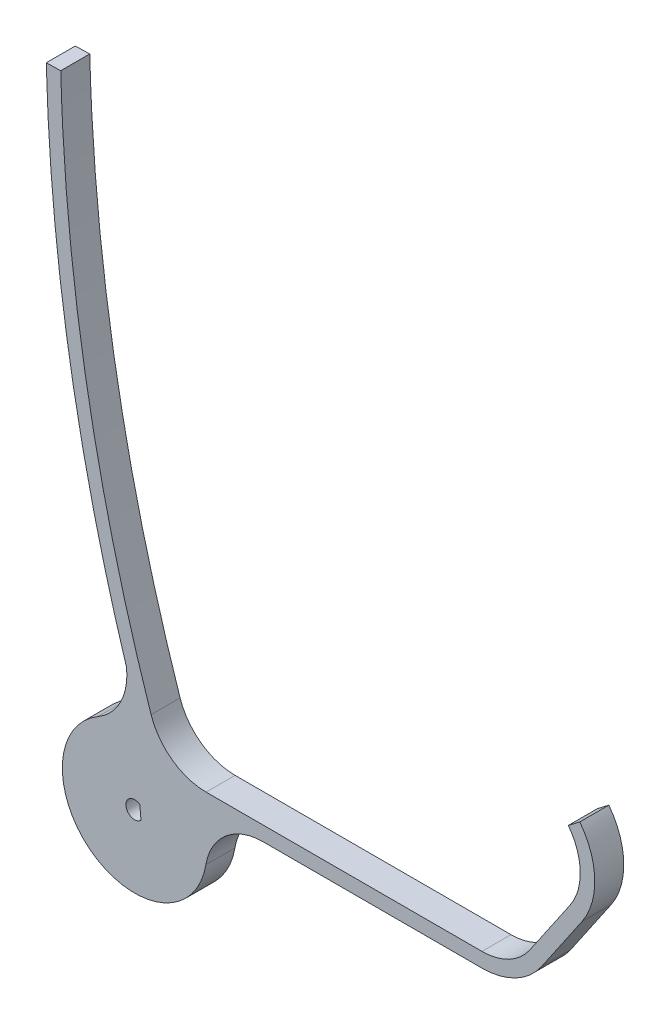
ISO-10303-21;
HEADER;
FILE_DESCRIPTION(('STEP AP214'),'2;1');
FILE_NAME('part.step','',(''),(''),'','','');
FILE_SCHEMA(('AUTOMOTIVE_DESIGN { 1 0 10303 214 1 1 1 1 }'));
ENDSEC;
DATA;
#1=APPLICATION_CONTEXT('core data for automotive mechanical design processes');
#2=APPLICATION_PROTOCOL_DEFINITION('international standard','automotive_design',2000,#1);
#3=PRODUCT_CONTEXT('',#1,'mechanical');
#4=PRODUCT('Part','Part','',(#3));
#5=PRODUCT_RELATED_PRODUCT_CATEGORY('part','',(#4));
#6=PRODUCT_DEFINITION_FORMATION('','',#4);
#7=PRODUCT_DEFINITION_CONTEXT('part definition',#1,'design');
#8=PRODUCT_DEFINITION('design','',#6,#7);
#9=PRODUCT_DEFINITION_SHAPE('','',#8);
#10=(LENGTH_UNIT() NAMED_UNIT(*) SI_UNIT(.MILLI.,.METRE.));
#11=(NAMED_UNIT(*) PLANE_ANGLE_UNIT() SI_UNIT($,.RADIAN.));
#12=(NAMED_UNIT(*) SI_UNIT($,.STERADIAN.) SOLID_ANGLE_UNIT());
#13=UNCERTAINTY_MEASURE_WITH_UNIT(LENGTH_MEASURE(1.E-05),#10,'distance_accuracy_value','');
#14=(GEOMETRIC_REPRESENTATION_CONTEXT(3) GLOBAL_UNCERTAINTY_ASSIGNED_CONTEXT((#13)) GLOBAL_UNIT_ASSIGNED_CONTEXT((#10,
#11,#12)) REPRESENTATION_CONTEXT('',''));
#15=CARTESIAN_POINT('',(0.,0.,0.));
#16=DIRECTION('',(0.,0.,1.));
#17=DIRECTION('',(1.,0.,0.));
#18=AXIS2_PLACEMENT_3D('',#15,#16,#17);
#19=CARTESIAN_POINT('',(-1.09544401618113,41.3581316566819,-5.));
#20=DIRECTION('',(-0.0264775007978283,0.999649409518908,0.));
#21=DIRECTION('',(-0.999649409518908,-0.0264775007978283,0.));
#22=AXIS2_PLACEMENT_3D('',#19,#20,#21);
#23=PLANE('',#22);
#24=DIRECTION('',(-0.999649409518908,-0.0264775007978283,0.));
#25=VECTOR('',#24,1.);
#26=CARTESIAN_POINT('',(-1.09544401618113,41.3581316566819,0.));
#27=LINE('',#26,#25);
#28=CARTESIAN_POINT('',(-45.8899837622677,40.1716682320337,0.));
#29=VERTEX_POINT('',#28);
#30=CARTESIAN_POINT('',(-48.3891072861844,40.1054744800359,0.));
#31=VERTEX_POINT('',#30);
#32=EDGE_CURVE('E208',#29,#31,#27,.T.);
#33=ORIENTED_EDGE('',*,*,#32,.F.);
#34=DIRECTION('',(0.,0.,1.));
#35=VECTOR('',#34,1.);
#36=CARTESIAN_POINT('',(-45.8899837622677,40.1716682320337,-5.));
#37=LINE('',#36,#35);
#38=CARTESIAN_POINT('',(-45.8899837622677,40.1716682320337,-5.));
#39=VERTEX_POINT('',#38);
#40=EDGE_CURVE('E249',#39,#29,#37,.T.);
#41=ORIENTED_EDGE('',*,*,#40,.F.);
#42=DIRECTION('',(-0.999649409518908,-0.0264775007978283,0.));
#43=VECTOR('',#42,1.);
#44=CARTESIAN_POINT('',(-1.09544401618113,41.3581316566819,-5.));
#45=LINE('',#44,#43);
#46=CARTESIAN_POINT('',(-48.3891072861844,40.1054744800359,-5.));
#47=VERTEX_POINT('',#46);
#48=EDGE_CURVE('E210',#39,#47,#45,.T.);
#49=ORIENTED_EDGE('',*,*,#48,.T.);
#50=DIRECTION('',(0.,0.,1.));
#51=VECTOR('',#50,1.);
#52=CARTESIAN_POINT('',(-48.3891072861844,40.1054744800359,-5.));
#53=LINE('',#52,#51);
#54=EDGE_CURVE('E250',#47,#31,#53,.T.);
#55=ORIENTED_EDGE('',*,*,#54,.T.);
#56=EDGE_LOOP('',(#33,#41,#49,#55));
#57=FACE_BOUND('',#56,.T.);
#58=ADVANCED_FACE('F39',(#57),#23,.T.);
#59=CARTESIAN_POINT('',(986707.552112871,164089.765893082,-5.));
#60=CARTESIAN_POINT('',(-982178.543983185,-188171.282060806,-5.));
#61=CARTESIAN_POINT('',(977487.176227722,212216.742655477,-5.));
#62=B_SPLINE_CURVE_WITH_KNOTS('',2,(#59,#60,#61),.UNSPECIFIED.,.F.,.F.,(3,3),(0.,1.),.UNSPECIFIED.);
#63=DIRECTION('',(0.,0.,1.));
#64=VECTOR('',#63,1.);
#65=SURFACE_OF_LINEAR_EXTRUSION('',#62,#64);
#66=CARTESIAN_POINT('',(986707.552112871,164089.765893082,0.));
#67=CARTESIAN_POINT('',(-982178.543983185,-188171.282060806,0.));
#68=CARTESIAN_POINT('',(977487.176227722,212216.742655477,0.));
#69=B_SPLINE_CURVE_WITH_KNOTS('',2,(#66,#67,#68),.UNSPECIFIED.,.F.,.F.,(3,3),(0.,1.),.UNSPECIFIED.);
#70=CARTESIAN_POINT('',(-30.3198198251759,-48.1747394512281,0.));
#71=VERTEX_POINT('',#70);
#72=EDGE_CURVE('E214',#71,#29,#69,.T.);
#73=ORIENTED_EDGE('',*,*,#72,.F.);
#74=DIRECTION('',(0.,0.,1.));
#75=VECTOR('',#74,1.);
#76=CARTESIAN_POINT('',(-30.3198198251759,-48.1747394512281,-5.));
#77=LINE('',#76,#75);
#78=CARTESIAN_POINT('',(-30.3198198251759,-48.1747394512281,-5.));
#79=VERTEX_POINT('',#78);
#80=EDGE_CURVE('E279',#79,#71,#77,.T.);
#81=ORIENTED_EDGE('',*,*,#80,.F.);
#82=EDGE_CURVE('E253',#79,#39,#62,.T.);
#83=ORIENTED_EDGE('',*,*,#82,.T.);
#84=ORIENTED_EDGE('',*,*,#40,.T.);
#85=EDGE_LOOP('',(#73,#81,#83,#84));
#86=FACE_BOUND('',#85,.T.);
#87=ADVANCED_FACE('F235',(#86),#65,.T.);
#88=CARTESIAN_POINT('',(-20.837149873268,-45.,-5.));
#89=DIRECTION('',(0.,0.,1.));
#90=DIRECTION('',(1.,0.,0.));
#91=AXIS2_PLACEMENT_3D('',#88,#89,#90);
#92=CYLINDRICAL_SURFACE('',#91,10.);
#93=CARTESIAN_POINT('',(-20.837149873268,-45.,0.));
#94=DIRECTION('',(0.,0.,1.));
#95=DIRECTION('',(1.,0.,0.));
#96=AXIS2_PLACEMENT_3D('',#93,#94,#95);
#97=CIRCLE('',#96,10.);
#98=CARTESIAN_POINT('',(-20.837149873268,-55.,0.));
#99=VERTEX_POINT('',#98);
#100=EDGE_CURVE('E286',#71,#99,#97,.T.);
#101=ORIENTED_EDGE('',*,*,#100,.T.);
#102=DIRECTION('',(0.,0.,1.));
#103=VECTOR('',#102,1.);
#104=CARTESIAN_POINT('',(-20.837149873268,-55.,-5.));
#105=LINE('',#104,#103);
#106=CARTESIAN_POINT('',(-20.837149873268,-55.,-5.));
#107=VERTEX_POINT('',#106);
#108=EDGE_CURVE('E277',#107,#99,#105,.T.);
#109=ORIENTED_EDGE('',*,*,#108,.F.);
#110=CARTESIAN_POINT('',(-20.837149873268,-45.,-5.));
#111=DIRECTION('',(0.,0.,1.));
#112=DIRECTION('',(1.,0.,0.));
#113=AXIS2_PLACEMENT_3D('',#110,#111,#112);
#114=CIRCLE('',#113,10.);
#115=EDGE_CURVE('E343',#79,#107,#114,.T.);
#116=ORIENTED_EDGE('',*,*,#115,.F.);
#117=ORIENTED_EDGE('',*,*,#80,.T.);
#118=EDGE_LOOP('',(#101,#109,#116,#117));
#119=FACE_BOUND('',#118,.T.);
#120=ADVANCED_FACE('F352',(#119),#92,.F.);
#121=CARTESIAN_POINT('',(0.,-55.,-5.));
#122=DIRECTION('',(0.,1.,0.));
#123=DIRECTION('',(0.,0.,1.));
#124=AXIS2_PLACEMENT_3D('',#121,#122,#123);
#125=PLANE('',#124);
#126=DIRECTION('',(-1.,0.,0.));
#127=VECTOR('',#126,1.);
#128=CARTESIAN_POINT('',(0.,-55.,0.));
#129=LINE('',#128,#127);
#130=CARTESIAN_POINT('',(26.7198130855547,-55.,0.));
#131=VERTEX_POINT('',#130);
#132=EDGE_CURVE('E292',#131,#99,#129,.T.);
#133=ORIENTED_EDGE('',*,*,#132,.F.);
#134=DIRECTION('',(0.,0.,1.));
#135=VECTOR('',#134,1.);
#136=CARTESIAN_POINT('',(26.7198130855547,-55.,-5.));
#137=LINE('',#136,#135);
#138=CARTESIAN_POINT('',(26.7198130855547,-55.,-5.));
#139=VERTEX_POINT('',#138);
#140=EDGE_CURVE('E275',#139,#131,#137,.T.);
#141=ORIENTED_EDGE('',*,*,#140,.F.);
#142=DIRECTION('',(-1.,0.,0.));
#143=VECTOR('',#142,1.);
#144=CARTESIAN_POINT('',(0.,-55.,-5.));
#145=LINE('',#144,#143);
#146=EDGE_CURVE('E444',#139,#107,#145,.T.);
#147=ORIENTED_EDGE('',*,*,#146,.T.);
#148=ORIENTED_EDGE('',*,*,#108,.T.);
#149=EDGE_LOOP('',(#133,#141,#147,#148));
#150=FACE_BOUND('',#149,.T.);
#151=ADVANCED_FACE('F358',(#150),#125,.T.);
#152=CARTESIAN_POINT('',(26.7198130855547,-45.,-5.));
#153=DIRECTION('',(0.,0.,1.));
#154=DIRECTION('',(1.,0.,0.));
#155=AXIS2_PLACEMENT_3D('',#152,#153,#154);
#156=CYLINDRICAL_SURFACE('',#155,10.);
#157=CARTESIAN_POINT('',(26.7198130855547,-45.,0.));
#158=DIRECTION('',(0.,0.,1.));
#159=DIRECTION('',(1.,0.,0.));
#160=AXIS2_PLACEMENT_3D('',#157,#158,#159);
#161=CIRCLE('',#160,10.);
#162=CARTESIAN_POINT('',(34.97782290429,-50.6396164615753,0.));
#163=VERTEX_POINT('',#162);
#164=EDGE_CURVE('E295',#131,#163,#161,.T.);
#165=ORIENTED_EDGE('',*,*,#164,.T.);
#166=DIRECTION('',(0.,0.,1.));
#167=VECTOR('',#166,1.);
#168=CARTESIAN_POINT('',(34.97782290429,-50.6396164615753,-5.));
#169=LINE('',#168,#167);
#170=CARTESIAN_POINT('',(34.97782290429,-50.6396164615753,-5.));
#171=VERTEX_POINT('',#170);
#172=EDGE_CURVE('E273',#171,#163,#169,.T.);
#173=ORIENTED_EDGE('',*,*,#172,.F.);
#174=CARTESIAN_POINT('',(26.7198130855547,-45.,-5.));
#175=DIRECTION('',(0.,0.,1.));
#176=DIRECTION('',(1.,0.,0.));
#177=AXIS2_PLACEMENT_3D('',#174,#175,#176);
#178=CIRCLE('',#177,10.);
#179=EDGE_CURVE('E443',#139,#171,#178,.T.);
#180=ORIENTED_EDGE('',*,*,#179,.F.);
#181=ORIENTED_EDGE('',*,*,#140,.T.);
#182=EDGE_LOOP('',(#165,#173,#180,#181));
#183=FACE_BOUND('',#182,.T.);
#184=ADVANCED_FACE('F362',(#183),#156,.F.);
#185=CARTESIAN_POINT('',(47.4369168356998,-32.3959432048682,-5.));
#186=DIRECTION('',(-0.82580098187353,0.563961646157533,0.));
#187=DIRECTION('',(-0.563961646157533,-0.82580098187353,0.));
#188=AXIS2_PLACEMENT_3D('',#185,#186,#187);
#189=PLANE('',#188);
#190=DIRECTION('',(-0.563961646157533,-0.82580098187353,0.));
#191=VECTOR('',#190,1.);
#192=CARTESIAN_POINT('',(47.4369168356998,-32.3959432048682,0.));
#193=LINE('',#192,#191);
#194=CARTESIAN_POINT('',(41.9191665326047,-40.475506148686,0.));
#195=VERTEX_POINT('',#194);
#196=EDGE_CURVE('E298',#195,#163,#193,.T.);
#197=ORIENTED_EDGE('',*,*,#196,.F.);
#198=DIRECTION('',(0.,0.,1.));
#199=VECTOR('',#198,1.);
#200=CARTESIAN_POINT('',(41.9191665326047,-40.475506148686,-5.));
#201=LINE('',#200,#199);
#202=CARTESIAN_POINT('',(41.9191665326047,-40.475506148686,-5.));
#203=VERTEX_POINT('',#202);
#204=EDGE_CURVE('E271',#203,#195,#201,.T.);
#205=ORIENTED_EDGE('',*,*,#204,.F.);
#206=DIRECTION('',(-0.563961646157533,-0.82580098187353,0.));
#207=VECTOR('',#206,1.);
#208=CARTESIAN_POINT('',(47.4369168356998,-32.3959432048682,-5.));
#209=LINE('',#208,#207);
#210=EDGE_CURVE('E440',#203,#171,#209,.T.);
#211=ORIENTED_EDGE('',*,*,#210,.T.);
#212=ORIENTED_EDGE('',*,*,#172,.T.);
#213=EDGE_LOOP('',(#197,#205,#211,#212));
#214=FACE_BOUND('',#213,.T.);
#215=ADVANCED_FACE('F366',(#214),#189,.T.);
#216=CARTESIAN_POINT('',(33.6611567138694,-34.8358896871107,-5.));
#217=DIRECTION('',(0.,0.,1.));
#218=DIRECTION('',(1.,0.,0.));
#219=AXIS2_PLACEMENT_3D('',#216,#217,#218);
#220=CYLINDRICAL_SURFACE('',#219,10.);
#221=CARTESIAN_POINT('',(33.6611567138694,-34.8358896871107,0.));
#222=DIRECTION('',(0.,0.,1.));
#223=DIRECTION('',(1.,0.,0.));
#224=AXIS2_PLACEMENT_3D('',#221,#222,#223);
#225=CIRCLE('',#224,10.);
#226=CARTESIAN_POINT('',(41.6001190229847,-28.7553570250452,0.));
#227=VERTEX_POINT('',#226);
#228=EDGE_CURVE('E301',#195,#227,#225,.T.);
#229=ORIENTED_EDGE('',*,*,#228,.T.);
#230=DIRECTION('',(0.,0.,1.));
#231=VECTOR('',#230,1.);
#232=CARTESIAN_POINT('',(41.6001190229847,-28.7553570250452,-5.));
#233=LINE('',#232,#231);
#234=CARTESIAN_POINT('',(41.6001190229847,-28.7553570250452,-5.));
#235=VERTEX_POINT('',#234);
#236=EDGE_CURVE('E269',#235,#227,#233,.T.);
#237=ORIENTED_EDGE('',*,*,#236,.F.);
#238=CARTESIAN_POINT('',(33.6611567138694,-34.8358896871107,-5.));
#239=DIRECTION('',(0.,0.,1.));
#240=DIRECTION('',(1.,0.,0.));
#241=AXIS2_PLACEMENT_3D('',#238,#239,#240);
#242=CIRCLE('',#241,10.);
#243=EDGE_CURVE('E438',#203,#235,#242,.T.);
#244=ORIENTED_EDGE('',*,*,#243,.F.);
#245=ORIENTED_EDGE('',*,*,#204,.T.);
#246=EDGE_LOOP('',(#229,#237,#244,#245));
#247=FACE_BOUND('',#246,.T.);
#248=ADVANCED_FACE('F370',(#247),#220,.F.);
#249=CARTESIAN_POINT('',(29.2618689221314,-38.2053493300637,-5.));
#250=DIRECTION('',(-0.608053266206553,0.793896230911536,0.));
#251=DIRECTION('',(-0.793896230911536,-0.608053266206553,0.));
#252=AXIS2_PLACEMENT_3D('',#249,#250,#251);
#253=PLANE('',#252);
#254=DIRECTION('',(-0.793896230911536,-0.608053266206553,0.));
#255=VECTOR('',#254,1.);
#256=CARTESIAN_POINT('',(29.2618689221314,-38.2053493300637,0.));
#257=LINE('',#256,#255);
#258=CARTESIAN_POINT('',(43.5848596002636,-27.2352238595288,0.));
#259=VERTEX_POINT('',#258);
#260=EDGE_CURVE('E304',#259,#227,#257,.T.);
#261=ORIENTED_EDGE('',*,*,#260,.F.);
#262=DIRECTION('',(0.,0.,1.));
#263=VECTOR('',#262,1.);
#264=CARTESIAN_POINT('',(43.5848596002636,-27.2352238595288,-5.));
#265=LINE('',#264,#263);
#266=CARTESIAN_POINT('',(43.5848596002636,-27.2352238595288,-5.));
#267=VERTEX_POINT('',#266);
#268=EDGE_CURVE('E267',#267,#259,#265,.T.);
#269=ORIENTED_EDGE('',*,*,#268,.F.);
#270=DIRECTION('',(-0.793896230911536,-0.608053266206553,0.));
#271=VECTOR('',#270,1.);
#272=CARTESIAN_POINT('',(29.2618689221314,-38.2053493300637,-5.));
#273=LINE('',#272,#271);
#274=EDGE_CURVE('E435',#267,#235,#273,.T.);
#275=ORIENTED_EDGE('',*,*,#274,.T.);
#276=ORIENTED_EDGE('',*,*,#236,.T.);
#277=EDGE_LOOP('',(#261,#269,#275,#276));
#278=FACE_BOUND('',#277,.T.);
#279=ADVANCED_FACE('F374',(#278),#253,.T.);
#280=CARTESIAN_POINT('',(33.6611567138694,-34.8358896871107,-5.));
#281=DIRECTION('',(0.,0.,1.));
#282=DIRECTION('',(1.,0.,0.));
#283=AXIS2_PLACEMENT_3D('',#280,#281,#282);
#284=CYLINDRICAL_SURFACE('',#283,12.5);
#285=CARTESIAN_POINT('',(33.6611567138694,-34.8358896871107,0.));
#286=DIRECTION('',(0.,0.,1.));
#287=DIRECTION('',(1.,0.,0.));
#288=AXIS2_PLACEMENT_3D('',#285,#286,#287);
#289=CIRCLE('',#288,12.5);
#290=CARTESIAN_POINT('',(43.9836689872885,-41.8854102640799,0.));
#291=VERTEX_POINT('',#290);
#292=EDGE_CURVE('E307',#291,#259,#289,.T.);
#293=ORIENTED_EDGE('',*,*,#292,.F.);
#294=DIRECTION('',(0.,0.,1.));
#295=VECTOR('',#294,1.);
#296=CARTESIAN_POINT('',(43.9836689872885,-41.8854102640799,-5.));
#297=LINE('',#296,#295);
#298=CARTESIAN_POINT('',(43.9836689872885,-41.8854102640799,-5.));
#299=VERTEX_POINT('',#298);
#300=EDGE_CURVE('E265',#299,#291,#297,.T.);
#301=ORIENTED_EDGE('',*,*,#300,.F.);
#302=CARTESIAN_POINT('',(33.6611567138694,-34.8358896871107,-5.));
#303=DIRECTION('',(0.,0.,1.));
#304=DIRECTION('',(1.,0.,0.));
#305=AXIS2_PLACEMENT_3D('',#302,#303,#304);
#306=CIRCLE('',#305,12.5);
#307=EDGE_CURVE('E432',#299,#267,#306,.T.);
#308=ORIENTED_EDGE('',*,*,#307,.T.);
#309=ORIENTED_EDGE('',*,*,#268,.T.);
#310=EDGE_LOOP('',(#293,#301,#308,#309));
#311=FACE_BOUND('',#310,.T.);
#312=ADVANCED_FACE('F378',(#311),#284,.T.);
#313=CARTESIAN_POINT('',(49.5014192903836,-33.805847320262,-5.));
#314=DIRECTION('',(-0.82580098187353,0.563961646157532,0.));
#315=DIRECTION('',(-0.563961646157532,-0.82580098187353,0.));
#316=AXIS2_PLACEMENT_3D('',#313,#314,#315);
#317=PLANE('',#316);
#318=DIRECTION('',(-0.563961646157532,-0.82580098187353,0.));
#319=VECTOR('',#318,1.);
#320=CARTESIAN_POINT('',(49.5014192903836,-33.805847320262,0.));
#321=LINE('',#320,#319);
#322=CARTESIAN_POINT('',(37.0423253589739,-52.0495205769692,0.));
#323=VERTEX_POINT('',#322);
#324=EDGE_CURVE('E310',#291,#323,#321,.T.);
#325=ORIENTED_EDGE('',*,*,#324,.T.);
#326=DIRECTION('',(0.,0.,1.));
#327=VECTOR('',#326,1.);
#328=CARTESIAN_POINT('',(37.0423253589739,-52.0495205769692,-5.));
#329=LINE('',#328,#327);
#330=CARTESIAN_POINT('',(37.0423253589739,-52.0495205769692,-5.));
#331=VERTEX_POINT('',#330);
#332=EDGE_CURVE('E263',#331,#323,#329,.T.);
#333=ORIENTED_EDGE('',*,*,#332,.F.);
#334=DIRECTION('',(-0.563961646157532,-0.82580098187353,0.));
#335=VECTOR('',#334,1.);
#336=CARTESIAN_POINT('',(49.5014192903836,-33.805847320262,-5.));
#337=LINE('',#336,#335);
#338=EDGE_CURVE('E430',#299,#331,#337,.T.);
#339=ORIENTED_EDGE('',*,*,#338,.F.);
#340=ORIENTED_EDGE('',*,*,#300,.T.);
#341=EDGE_LOOP('',(#325,#333,#339,#340));
#342=FACE_BOUND('',#341,.T.);
#343=ADVANCED_FACE('F382',(#342),#317,.F.);
#344=CARTESIAN_POINT('',(26.7198130855547,-45.,-5.));
#345=DIRECTION('',(0.,0.,1.));
#346=DIRECTION('',(1.,0.,0.));
#347=AXIS2_PLACEMENT_3D('',#344,#345,#346);
#348=CYLINDRICAL_SURFACE('',#347,12.5);
#349=CARTESIAN_POINT('',(26.7198130855547,-45.,0.));
#350=DIRECTION('',(0.,0.,1.));
#351=DIRECTION('',(1.,0.,0.));
#352=AXIS2_PLACEMENT_3D('',#349,#350,#351);
#353=CIRCLE('',#352,12.5);
#354=CARTESIAN_POINT('',(26.7198130855547,-57.5,0.));
#355=VERTEX_POINT('',#354);
#356=EDGE_CURVE('E313',#355,#323,#353,.T.);
#357=ORIENTED_EDGE('',*,*,#356,.F.);
#358=DIRECTION('',(0.,0.,1.));
#359=VECTOR('',#358,1.);
#360=CARTESIAN_POINT('',(26.7198130855547,-57.5,-5.));
#361=LINE('',#360,#359);
#362=CARTESIAN_POINT('',(26.7198130855547,-57.5,-5.));
#363=VERTEX_POINT('',#362);
#364=EDGE_CURVE('E261',#363,#355,#361,.T.);
#365=ORIENTED_EDGE('',*,*,#364,.F.);
#366=CARTESIAN_POINT('',(26.7198130855547,-45.,-5.));
#367=DIRECTION('',(0.,0.,1.));
#368=DIRECTION('',(1.,0.,0.));
#369=AXIS2_PLACEMENT_3D('',#366,#367,#368);
#370=CIRCLE('',#369,12.5);
#371=EDGE_CURVE('E427',#363,#331,#370,.T.);
#372=ORIENTED_EDGE('',*,*,#371,.T.);
#373=ORIENTED_EDGE('',*,*,#332,.T.);
#374=EDGE_LOOP('',(#357,#365,#372,#373));
#375=FACE_BOUND('',#374,.T.);
#376=ADVANCED_FACE('F386',(#375),#348,.T.);
#377=CARTESIAN_POINT('',(0.,-57.5,-5.));
#378=DIRECTION('',(0.,1.,0.));
#379=DIRECTION('',(-1.,0.,0.));
#380=AXIS2_PLACEMENT_3D('',#377,#378,#379);
#381=PLANE('',#380);
#382=DIRECTION('',(-1.,0.,0.));
#383=VECTOR('',#382,1.);
#384=CARTESIAN_POINT('',(0.,-57.5,0.));
#385=LINE('',#384,#383);
#386=CARTESIAN_POINT('',(-11.005286187164,-57.5,0.));
#387=VERTEX_POINT('',#386);
#388=EDGE_CURVE('E316',#355,#387,#385,.T.);
#389=ORIENTED_EDGE('',*,*,#388,.T.);
#390=DIRECTION('',(0.,0.,1.));
#391=VECTOR('',#390,1.);
#392=CARTESIAN_POINT('',(-11.005286187164,-57.5,-5.));
#393=LINE('',#392,#391);
#394=CARTESIAN_POINT('',(-11.005286187164,-57.5,-5.));
#395=VERTEX_POINT('',#394);
#396=EDGE_CURVE('E259',#395,#387,#393,.T.);
#397=ORIENTED_EDGE('',*,*,#396,.F.);
#398=DIRECTION('',(-1.,0.,0.));
#399=VECTOR('',#398,1.);
#400=CARTESIAN_POINT('',(0.,-57.5,-5.));
#401=LINE('',#400,#399);
#402=EDGE_CURVE('E423',#363,#395,#401,.T.);
#403=ORIENTED_EDGE('',*,*,#402,.F.);
#404=ORIENTED_EDGE('',*,*,#364,.T.);
#405=EDGE_LOOP('',(#389,#397,#403,#404));
#406=FACE_BOUND('',#405,.T.);
#407=ADVANCED_FACE('F390',(#406),#381,.F.);
#408=CARTESIAN_POINT('',(-11.005286187164,-67.5,-5.));
#409=DIRECTION('',(0.,0.,1.));
#410=DIRECTION('',(1.,0.,0.));
#411=AXIS2_PLACEMENT_3D('',#408,#409,#410);
#412=CYLINDRICAL_SURFACE('',#411,10.);
#413=CARTESIAN_POINT('',(-11.005286187164,-67.5,0.));
#414=DIRECTION('',(0.,0.,1.));
#415=DIRECTION('',(1.,0.,0.));
#416=AXIS2_PLACEMENT_3D('',#413,#414,#415);
#417=CIRCLE('',#416,10.);
#418=CARTESIAN_POINT('',(-20.8673451475003,-65.8447679731078,0.));
#419=VERTEX_POINT('',#418);
#420=EDGE_CURVE('E319',#419,#387,#417,.F.);
#421=ORIENTED_EDGE('',*,*,#420,.F.);
#422=DIRECTION('',(0.,0.,1.));
#423=VECTOR('',#422,1.);
#424=CARTESIAN_POINT('',(-20.8673451475003,-65.8447679731078,-5.));
#425=LINE('',#424,#423);
#426=CARTESIAN_POINT('',(-20.8673451475003,-65.8447679731078,-5.));
#427=VERTEX_POINT('',#426);
#428=EDGE_CURVE('E257',#427,#419,#425,.T.);
#429=ORIENTED_EDGE('',*,*,#428,.F.);
#430=CARTESIAN_POINT('',(-11.005286187164,-67.5,-5.));
#431=DIRECTION('',(0.,0.,1.));
#432=DIRECTION('',(1.,0.,0.));
#433=AXIS2_PLACEMENT_3D('',#430,#431,#432);
#434=CIRCLE('',#433,10.);
#435=EDGE_CURVE('E422',#427,#395,#434,.F.);
#436=ORIENTED_EDGE('',*,*,#435,.T.);
#437=ORIENTED_EDGE('',*,*,#396,.T.);
#438=EDGE_LOOP('',(#421,#429,#436,#437));
#439=FACE_BOUND('',#438,.T.);
#440=ADVANCED_FACE('F394',(#439),#412,.F.);
#441=CARTESIAN_POINT('',(-33.1578976294645,-63.7819415209272,-5.));
#442=DIRECTION('',(0.,0.,1.));
#443=DIRECTION('',(1.,0.,0.));
#444=AXIS2_PLACEMENT_3D('',#441,#442,#443);
#445=CYLINDRICAL_SURFACE('',#444,12.4624609641809);
#446=CARTESIAN_POINT('',(-33.1578976294645,-63.7819415209272,0.));
#447=DIRECTION('',(0.,0.,1.));
#448=DIRECTION('',(1.,0.,0.));
#449=AXIS2_PLACEMENT_3D('',#446,#447,#448);
#450=CIRCLE('',#449,12.4624609641809);
#451=CARTESIAN_POINT('',(-39.4468414308714,-53.0226609154927,0.));
#452=VERTEX_POINT('',#451);
#453=EDGE_CURVE('E322',#452,#419,#450,.T.);
#454=ORIENTED_EDGE('',*,*,#453,.F.);
#455=DIRECTION('',(0.,0.,1.));
#456=VECTOR('',#455,1.);
#457=CARTESIAN_POINT('',(-39.4468414308714,-53.0226609154927,-5.));
#458=LINE('',#457,#456);
#459=CARTESIAN_POINT('',(-39.4468414308714,-53.0226609154927,-5.));
#460=VERTEX_POINT('',#459);
#461=EDGE_CURVE('E255',#460,#452,#458,.T.);
#462=ORIENTED_EDGE('',*,*,#461,.F.);
#463=CARTESIAN_POINT('',(-33.1578976294645,-63.7819415209272,-5.));
#464=DIRECTION('',(0.,0.,1.));
#465=DIRECTION('',(1.,0.,0.));
#466=AXIS2_PLACEMENT_3D('',#463,#464,#465);
#467=CIRCLE('',#466,12.4624609641809);
#468=EDGE_CURVE('E418',#460,#427,#467,.T.);
#469=ORIENTED_EDGE('',*,*,#468,.T.);
#470=ORIENTED_EDGE('',*,*,#428,.T.);
#471=EDGE_LOOP('',(#454,#462,#469,#470));
#472=FACE_BOUND('',#471,.T.);
#473=ADVANCED_FACE('F397',(#472),#445,.T.);
#474=CARTESIAN_POINT('',(-44.4931511601314,-44.3893094158504,-5.));
#475=DIRECTION('',(0.,0.,1.));
#476=DIRECTION('',(1.,0.,0.));
#477=AXIS2_PLACEMENT_3D('',#474,#475,#476);
#478=CYLINDRICAL_SURFACE('',#477,10.);
#479=CARTESIAN_POINT('',(-44.4931511601314,-44.3893094158504,0.));
#480=DIRECTION('',(0.,0.,1.));
#481=DIRECTION('',(1.,0.,0.));
#482=AXIS2_PLACEMENT_3D('',#479,#480,#481);
#483=CIRCLE('',#482,10.);
#484=CARTESIAN_POINT('',(-34.5672345280165,-43.1743283409755,0.));
#485=VERTEX_POINT('',#484);
#486=EDGE_CURVE('E325',#452,#485,#483,.T.);
#487=ORIENTED_EDGE('',*,*,#486,.T.);
#488=DIRECTION('',(0.,0.,1.));
#489=VECTOR('',#488,1.);
#490=CARTESIAN_POINT('',(-34.5672345280165,-43.1743283409755,-5.));
#491=LINE('',#490,#489);
#492=CARTESIAN_POINT('',(-34.5672345280165,-43.1743283409755,-5.));
#493=VERTEX_POINT('',#492);
#494=EDGE_CURVE('E252',#493,#485,#491,.T.);
#495=ORIENTED_EDGE('',*,*,#494,.F.);
#496=CARTESIAN_POINT('',(-44.4931511601314,-44.3893094158504,-5.));
#497=DIRECTION('',(0.,0.,1.));
#498=DIRECTION('',(1.,0.,0.));
#499=AXIS2_PLACEMENT_3D('',#496,#497,#498);
#500=CIRCLE('',#499,10.);
#501=EDGE_CURVE('E220',#460,#493,#500,.T.);
#502=ORIENTED_EDGE('',*,*,#501,.F.);
#503=ORIENTED_EDGE('',*,*,#461,.T.);
#504=EDGE_LOOP('',(#487,#495,#502,#503));
#505=FACE_BOUND('',#504,.T.);
#506=ADVANCED_FACE('F231',(#505),#478,.F.);
#507=CARTESIAN_POINT('',(-48.3891072861844,40.1054744800359,-5.));
#508=CARTESIAN_POINT('',(-48.2882995339594,36.2995106630215,-5.));
#509=CARTESIAN_POINT('',(-47.9474972133717,28.6772328007071,-5.));
#510=CARTESIAN_POINT('',(-46.7138081032787,13.5747993423337,-5.));
#511=CARTESIAN_POINT('',(-44.1345663346842,-5.11901755671337,-5.));
#512=CARTESIAN_POINT('',(-40.1714752988364,-23.5473535617767,-5.));
#513=CARTESIAN_POINT('',(-36.8422883032158,-35.6874586344321,-5.));
#514=CARTESIAN_POINT('',(-35.0955826104307,-41.4908055690066,-5.));
#515=CARTESIAN_POINT('',(-33.9628220538748,-45.1091937882463,-5.));
#516=CARTESIAN_POINT('',(-33.173391948454,-47.5260302706382,-5.));
#517=CARTESIAN_POINT('',(-32.6904873133156,-48.9684243139927,-5.));
#518=B_SPLINE_CURVE_WITH_KNOTS('',3,(#507,#508,#509,#510,#511,#512,#513,#514,#515,#516,#517),
.UNSPECIFIED.,.F.,.F.,(4,1,1,1,1,1,1,1,4),(0.499175674788358,0.499404485873642,
0.499633296958926,0.500090919129494,0.500548541300061,0.500777352385345,0.500853238254405,
0.500914408340895,0.501006163470629),.UNSPECIFIED.);
#519=DIRECTION('',(0.,0.,1.));
#520=VECTOR('',#519,1.);
#521=SURFACE_OF_LINEAR_EXTRUSION('',#518,#520);
#522=CARTESIAN_POINT('',(-48.3891072861844,40.1054744800359,0.));
#523=CARTESIAN_POINT('',(-48.2882995339594,36.2995106630215,0.));
#524=CARTESIAN_POINT('',(-47.9474972133717,28.6772328007071,0.));
#525=CARTESIAN_POINT('',(-46.7138081032787,13.5747993423337,0.));
#526=CARTESIAN_POINT('',(-44.1345663346842,-5.11901755671337,0.));
#527=CARTESIAN_POINT('',(-40.1714752988364,-23.5473535617767,0.));
#528=CARTESIAN_POINT('',(-36.8422883032158,-35.6874586344321,0.));
#529=CARTESIAN_POINT('',(-35.0955826104307,-41.4908055690066,0.));
#530=CARTESIAN_POINT('',(-33.9628220538748,-45.1091937882463,0.));
#531=CARTESIAN_POINT('',(-33.173391948454,-47.5260302706382,0.));
#532=CARTESIAN_POINT('',(-32.6904873133156,-48.9684243139927,0.));
#533=B_SPLINE_CURVE_WITH_KNOTS('',3,(#522,#523,#524,#525,#526,#527,#528,#529,#530,#531,#532),
.UNSPECIFIED.,.F.,.F.,(4,1,1,1,1,1,1,1,4),(0.499175674788358,0.499404485873642,
0.499633296958926,0.500090919129494,0.500548541300061,0.500777352385345,0.500853238254405,
0.500914408340895,0.501006163470629),.UNSPECIFIED.);
#534=EDGE_CURVE('E328',#31,#485,#533,.T.);
#535=ORIENTED_EDGE('',*,*,#534,.F.);
#536=ORIENTED_EDGE('',*,*,#54,.F.);
#537=EDGE_CURVE('E213',#47,#493,#518,.T.);
#538=ORIENTED_EDGE('',*,*,#537,.T.);
#539=ORIENTED_EDGE('',*,*,#494,.T.);
#540=EDGE_LOOP('',(#535,#536,#538,#539));
#541=FACE_BOUND('',#540,.T.);
#542=ADVANCED_FACE('F226',(#541),#521,.T.);
#543=CARTESIAN_POINT('',(0.,0.,-5.));
#544=DIRECTION('',(0.,0.,1.));
#545=DIRECTION('',(1.,0.,0.));
#546=AXIS2_PLACEMENT_3D('',#543,#544,#545);
#547=PLANE('',#546);
#548=DIRECTION('',(0.096251925922402,-0.995357004675322,0.));
#549=VECTOR('',#548,1.);
#550=CARTESIAN_POINT('',(-31.1675674612919,-3.01393206696154,-5.));
#551=LINE('',#550,#549);
#552=CARTESIAN_POINT('',(-25.0905243234094,-65.857635162129,-5.));
#553=VERTEX_POINT('',#552);
#554=CARTESIAN_POINT('',(-25.6377273839563,-60.1989182681488,-5.));
#555=VERTEX_POINT('',#554);
#556=EDGE_CURVE('E246',#553,#555,#551,.F.);
#557=ORIENTED_EDGE('',*,*,#556,.T.);
#558=CARTESIAN_POINT('',(-33.1578976294645,-63.7819415209272,-5.));
#559=DIRECTION('',(0.,0.,1.));
#560=DIRECTION('',(1.,0.,0.));
#561=AXIS2_PLACEMENT_3D('',#558,#559,#560);
#562=CIRCLE('',#561,8.3301270189222);
#563=EDGE_CURVE('E58',#555,#553,#562,.T.);
#564=ORIENTED_EDGE('',*,*,#563,.T.);
#565=EDGE_LOOP('',(#557,#564));
#566=FACE_BOUND('',#565,.T.);
#567=ORIENTED_EDGE('',*,*,#48,.F.);
#568=ORIENTED_EDGE('',*,*,#82,.F.);
#569=ORIENTED_EDGE('',*,*,#115,.T.);
#570=ORIENTED_EDGE('',*,*,#146,.F.);
#571=ORIENTED_EDGE('',*,*,#179,.T.);
#572=ORIENTED_EDGE('',*,*,#210,.F.);
#573=ORIENTED_EDGE('',*,*,#243,.T.);
#574=ORIENTED_EDGE('',*,*,#274,.F.);
#575=ORIENTED_EDGE('',*,*,#307,.F.);
#576=ORIENTED_EDGE('',*,*,#338,.T.);
#577=ORIENTED_EDGE('',*,*,#371,.F.);
#578=ORIENTED_EDGE('',*,*,#402,.T.);
#579=ORIENTED_EDGE('',*,*,#435,.F.);
#580=ORIENTED_EDGE('',*,*,#468,.F.);
#581=ORIENTED_EDGE('',*,*,#501,.T.);
#582=ORIENTED_EDGE('',*,*,#537,.F.);
#583=EDGE_LOOP('',(#567,#568,#569,#570,#571,#572,#573,#574,#575,#576,#577,#578,#579,#580,#581,#582));
#584=FACE_BOUND('',#583,.T.);
#585=ADVANCED_FACE('F230',(#566,#584),#547,.F.);
#586=CARTESIAN_POINT('',(0.,0.,0.));
#587=DIRECTION('',(0.,0.,1.));
#588=DIRECTION('',(1.,0.,0.));
#589=AXIS2_PLACEMENT_3D('',#586,#587,#588);
#590=PLANE('',#589);
#591=ORIENTED_EDGE('',*,*,#32,.T.);
#592=ORIENTED_EDGE('',*,*,#534,.T.);
#593=ORIENTED_EDGE('',*,*,#486,.F.);
#594=ORIENTED_EDGE('',*,*,#453,.T.);
#595=ORIENTED_EDGE('',*,*,#420,.T.);
#596=ORIENTED_EDGE('',*,*,#388,.F.);
#597=ORIENTED_EDGE('',*,*,#356,.T.);
#598=ORIENTED_EDGE('',*,*,#324,.F.);
#599=ORIENTED_EDGE('',*,*,#292,.T.);
#600=ORIENTED_EDGE('',*,*,#260,.T.);
#601=ORIENTED_EDGE('',*,*,#228,.F.);
#602=ORIENTED_EDGE('',*,*,#196,.T.);
#603=ORIENTED_EDGE('',*,*,#164,.F.);
#604=ORIENTED_EDGE('',*,*,#132,.T.);
#605=ORIENTED_EDGE('',*,*,#100,.F.);
#606=ORIENTED_EDGE('',*,*,#72,.T.);
#607=EDGE_LOOP('',(#591,#592,#593,#594,#595,#596,#597,#598,#599,#600,#601,#602,#603,#604,#605,#606));
#608=FACE_BOUND('',#607,.T.);
#609=CARTESIAN_POINT('',(-33.1578976294645,-63.7819415209272,0.));
#610=DIRECTION('',(0.,0.,1.));
#611=DIRECTION('',(1.,0.,0.));
#612=AXIS2_PLACEMENT_3D('',#609,#610,#611);
#613=CIRCLE('',#612,1.5);
#614=CARTESIAN_POINT('',(-32.2701535494531,-62.5728466328375,0.));
#615=VERTEX_POINT('',#614);
#616=CARTESIAN_POINT('',(-32.0549277001253,-64.7985325571721,0.));
#617=VERTEX_POINT('',#616);
#618=EDGE_CURVE('E200',#615,#617,#613,.T.);
#619=ORIENTED_EDGE('',*,*,#618,.F.);
#620=DIRECTION('',(-0.0962519259224028,0.995357004675322,0.));
#621=VECTOR('',#620,1.);
#622=CARTESIAN_POINT('',(-37.9659822323983,-3.67134494682746,0.));
#623=LINE('',#622,#621);
#624=EDGE_CURVE('E191',#617,#615,#623,.T.);
#625=ORIENTED_EDGE('',*,*,#624,.F.);
#626=EDGE_LOOP('',(#619,#625));
#627=FACE_BOUND('',#626,.T.);
#628=ADVANCED_FACE('F354',(#608,#627),#590,.T.);
#629=CARTESIAN_POINT('',(-33.1578976294645,-63.7819415209272,-7.5));
#630=DIRECTION('',(0.,0.,1.));
#631=DIRECTION('',(1.,0.,0.));
#632=AXIS2_PLACEMENT_3D('',#629,#630,#631);
#633=CYLINDRICAL_SURFACE('',#632,1.5);
#634=ORIENTED_EDGE('',*,*,#618,.T.);
#635=DIRECTION('',(0.,0.,1.));
#636=VECTOR('',#635,1.);
#637=CARTESIAN_POINT('',(-32.0549277001253,-64.7985325571721,-7.5));
#638=LINE('',#637,#636);
#639=CARTESIAN_POINT('',(-32.0549277001253,-64.7985325571721,-7.5));
#640=VERTEX_POINT('',#639);
#641=EDGE_CURVE('E195',#640,#617,#638,.T.);
#642=ORIENTED_EDGE('',*,*,#641,.F.);
#643=CARTESIAN_POINT('',(-33.1578976294645,-63.7819415209272,-7.5));
#644=DIRECTION('',(0.,0.,1.));
#645=DIRECTION('',(1.,0.,0.));
#646=AXIS2_PLACEMENT_3D('',#643,#644,#645);
#647=CIRCLE('',#646,1.5);
#648=CARTESIAN_POINT('',(-32.2701535494531,-62.5728466328375,-7.5));
#649=VERTEX_POINT('',#648);
#650=EDGE_CURVE('E182',#649,#640,#647,.T.);
#651=ORIENTED_EDGE('',*,*,#650,.F.);
#652=DIRECTION('',(0.,0.,1.));
#653=VECTOR('',#652,1.);
#654=CARTESIAN_POINT('',(-32.2701535494531,-62.5728466328375,-7.5));
#655=LINE('',#654,#653);
#656=EDGE_CURVE('E189',#649,#615,#655,.T.);
#657=ORIENTED_EDGE('',*,*,#656,.T.);
#658=EDGE_LOOP('',(#634,#642,#651,#657));
#659=FACE_BOUND('',#658,.T.);
#660=ADVANCED_FACE('F198',(#659),#633,.F.);
#661=CARTESIAN_POINT('',(-37.9659822323983,-3.67134494682746,-7.5));
#662=DIRECTION('',(0.995357004675322,0.0962519259224028,0.));
#663=DIRECTION('',(-0.0962519259224028,0.995357004675322,0.));
#664=AXIS2_PLACEMENT_3D('',#661,#662,#663);
#665=PLANE('',#664);
#666=ORIENTED_EDGE('',*,*,#624,.T.);
#667=ORIENTED_EDGE('',*,*,#656,.F.);
#668=DIRECTION('',(-0.0962519259224028,0.995357004675322,0.));
#669=VECTOR('',#668,1.);
#670=CARTESIAN_POINT('',(-37.9659822323983,-3.67134494682746,-7.5));
#671=LINE('',#670,#669);
#672=EDGE_CURVE('E177',#640,#649,#671,.T.);
#673=ORIENTED_EDGE('',*,*,#672,.F.);
#674=ORIENTED_EDGE('',*,*,#641,.T.);
#675=EDGE_LOOP('',(#666,#667,#673,#674));
#676=FACE_BOUND('',#675,.T.);
#677=ADVANCED_FACE('F190',(#676),#665,.F.);
#678=CARTESIAN_POINT('',(0.,0.,-7.5));
#679=DIRECTION('',(0.,0.,1.));
#680=DIRECTION('',(1.,0.,0.));
#681=AXIS2_PLACEMENT_3D('',#678,#679,#680);
#682=PLANE('',#681);
#683=ORIENTED_EDGE('',*,*,#650,.T.);
#684=ORIENTED_EDGE('',*,*,#672,.T.);
#685=EDGE_LOOP('',(#683,#684));
#686=FACE_BOUND('',#685,.T.);
#687=CARTESIAN_POINT('',(-33.1578976294645,-63.7819415209272,-7.5));
#688=DIRECTION('',(0.,0.,1.));
#689=DIRECTION('',(1.,0.,0.));
#690=AXIS2_PLACEMENT_3D('',#687,#688,#689);
#691=CIRCLE('',#690,4.00000000000001);
#692=CARTESIAN_POINT('',(-29.8605391661699,-61.5175592288796,-7.5));
#693=VERTEX_POINT('',#692);
#694=CARTESIAN_POINT('',(-29.487757060032,-65.372560331518,-7.5));
#695=VERTEX_POINT('',#694);
#696=EDGE_CURVE('E186',#693,#695,#691,.T.);
#697=ORIENTED_EDGE('',*,*,#696,.F.);
#698=DIRECTION('',(-0.096251925922402,0.995357004675322,0.));
#699=VECTOR('',#698,1.);
#700=CARTESIAN_POINT('',(-35.47758972071,-3.43071513202143,-7.5));
#701=LINE('',#700,#699);
#702=EDGE_CURVE('E196',#695,#693,#701,.T.);
#703=ORIENTED_EDGE('',*,*,#702,.F.);
#704=EDGE_LOOP('',(#697,#703));
#705=FACE_BOUND('',#704,.T.);
#706=ADVANCED_FACE('F179',(#686,#705),#682,.F.);
#707=CARTESIAN_POINT('',(-33.1578976294645,-63.7819415209272,-10.));
#708=DIRECTION('',(0.,0.,1.));
#709=DIRECTION('',(1.,0.,0.));
#710=AXIS2_PLACEMENT_3D('',#707,#708,#709);
#711=TOROIDAL_SURFACE('',#710,8.3301270189222,5.);
#712=ORIENTED_EDGE('',*,*,#563,.F.);
#713=CARTESIAN_POINT('',(-29.8605391661699,-61.5175592288796,-7.5));
#714=CARTESIAN_POINT('',(-29.7919922518487,-61.4926047227281,-7.37763998762623));
#715=CARTESIAN_POINT('',(-29.718440095925,-61.4661020813381,-7.25841734694207));
#716=CARTESIAN_POINT('',(-29.5619292361245,-61.4103776828503,-7.02701532258522));
#717=CARTESIAN_POINT('',(-29.4789720435663,-61.3811563627587,-6.91483481178391));
#718=CARTESIAN_POINT('',(-29.3043417990107,-61.3204014813245,-6.69838107926325));
#719=CARTESIAN_POINT('',(-29.2126797632606,-61.2888708537506,-6.59409815572127));
#720=CARTESIAN_POINT('',(-29.0212471728502,-61.2238336347276,-6.39398100469524));
#721=CARTESIAN_POINT('',(-28.9214764745146,-61.1903270082692,-6.29814692697686));
#722=CARTESIAN_POINT('',(-28.6105163501527,-61.087190872151,-6.02383890016333));
#723=CARTESIAN_POINT('',(-28.3879485819166,-61.0150396277756,-5.85889256650404));
#724=CARTESIAN_POINT('',(-27.9190194496183,-60.8666998807346,-5.56979481388648));
#725=CARTESIAN_POINT('',(-27.6726532566378,-60.7905105601278,-5.44565169686737));
#726=CARTESIAN_POINT('',(-27.1882717228945,-60.644029050136,-5.25154832751292));
#727=CARTESIAN_POINT('',(-26.951861590484,-60.5739037134467,-5.17742808114015));
#728=CARTESIAN_POINT('',(-26.4707706061272,-60.4337867632726,-5.06665115819643));
#729=CARTESIAN_POINT('',(-26.2261068458941,-60.3637951566686,-5.02992144726756));
#730=CARTESIAN_POINT('',(-25.8739319699534,-60.2646807196656,-5.004644016029));
#731=CARTESIAN_POINT('',(-25.7675236665935,-60.234944915868,-5.00057556194253));
#732=CARTESIAN_POINT('',(-25.6532798584868,-60.2032322725023,-5.00001896518445));
#733=CARTESIAN_POINT('',(-25.6455037429466,-60.2010747778755,-5.00000001569352));
#734=CARTESIAN_POINT('',(-25.6377273839563,-60.1989182681488,-5.));
#735=B_SPLINE_CURVE_WITH_KNOTS('',3,(#713,#714,#715,#716,#717,#718,#719,#720,#721,#722,#723,
#724,#725,#726,#727,#728,#729,#730,#731,#732,#733,#734),.UNSPECIFIED.,.F.,.F.,(4,2,2,2,2,2,2,2,
2,2,4),(0.,0.427210765172501,0.854352977832071,1.28096165513042,1.70757789304641,
2.56211147574517,3.41681881681727,4.1865451861769,4.95476515918042,5.28624848459713,
5.31045807621098),.UNSPECIFIED.);
#736=EDGE_CURVE('E52',#555,#693,#735,.F.);
#737=ORIENTED_EDGE('',*,*,#736,.T.);
#738=ORIENTED_EDGE('',*,*,#696,.T.);
#739=CARTESIAN_POINT('',(-29.487757060032,-65.372560331518,-7.5));
#740=CARTESIAN_POINT('',(-29.4156987079793,-65.3839181807718,-7.37763998762623));
#741=CARTESIAN_POINT('',(-29.3384312174957,-65.3958364254423,-7.25841734694206));
#742=CARTESIAN_POINT('',(-29.1741429713296,-65.4205392591665,-7.0270153225852));
#743=CARTESIAN_POINT('',(-29.0871237826976,-65.433323708895,-6.91483481178389));
#744=CARTESIAN_POINT('',(-28.9040879923115,-65.4594919600664,-6.69838107926323));
#745=CARTESIAN_POINT('',(-28.8080827648257,-65.4728749929238,-6.59409815572125));
#746=CARTESIAN_POINT('',(-28.6077354180569,-65.5000267363696,-6.39398100469523));
#747=CARTESIAN_POINT('',(-28.5033931510524,-65.5137954537889,-6.29814692697686));
#748=CARTESIAN_POINT('',(-28.1784328443603,-65.5554375069451,-6.02383890016333));
#749=CARTESIAN_POINT('',(-27.9461641005128,-65.5836056477081,-5.85889256650405));
#750=CARTESIAN_POINT('',(-27.4575003060595,-65.6393452894437,-5.56979481388648));
#751=CARTESIAN_POINT('',(-27.2011003592841,-65.6669166679326,-5.44565169686737));
#752=CARTESIAN_POINT('',(-26.6976265357767,-65.7178716681175,-5.25154832751292));
#753=CARTESIAN_POINT('',(-26.4521600953605,-65.7413991027737,-5.17742808114014));
#754=CARTESIAN_POINT('',(-25.9531353647611,-65.7867379735782,-5.06665115819643));
#755=CARTESIAN_POINT('',(-25.6995938509197,-65.8085526779173,-5.02992144726756));
#756=CARTESIAN_POINT('',(-25.3349530532759,-65.8383503885672,-5.004644016029));
#757=CARTESIAN_POINT('',(-25.2248186960907,-65.8471463205143,-5.00057556194253));
#758=CARTESIAN_POINT('',(-25.1066152348373,-65.8563811019227,-5.00001896518445));
#759=CARTESIAN_POINT('',(-25.0985698042345,-65.8570086386751,-5.00000001569352));
#760=CARTESIAN_POINT('',(-25.0905243234093,-65.857635162129,-5.));
#761=B_SPLINE_CURVE_WITH_KNOTS('',3,(#739,#740,#741,#742,#743,#744,#745,#746,#747,#748,#749,
#750,#751,#752,#753,#754,#755,#756,#757,#758,#759,#760),.UNSPECIFIED.,.F.,.F.,(4,2,2,2,2,2,2,2,
2,2,4),(0.,0.427210765172521,0.854352977832108,1.28096165513044,1.70757789304641,
2.56211147574515,3.41681881681727,4.18654518617692,4.95476515918041,5.28624848459716,
5.31045807621101),.UNSPECIFIED.);
#762=EDGE_CURVE('E11',#695,#553,#761,.T.);
#763=ORIENTED_EDGE('',*,*,#762,.T.);
#764=EDGE_LOOP('',(#712,#737,#738,#763));
#765=FACE_BOUND('',#764,.T.);
#766=ADVANCED_FACE('F237',(#765),#711,.F.);
#767=CARTESIAN_POINT('',(-31.1675674612919,-3.01393206696154,-10.));
#768=DIRECTION('',(0.096251925922402,-0.995357004675322,0.));
#769=DIRECTION('',(0.995357004675322,0.096251925922402,0.));
#770=AXIS2_PLACEMENT_3D('',#767,#768,#769);
#771=CYLINDRICAL_SURFACE('',#770,5.);
#772=ORIENTED_EDGE('',*,*,#762,.F.);
#773=ORIENTED_EDGE('',*,*,#702,.T.);
#774=ORIENTED_EDGE('',*,*,#736,.F.);
#775=ORIENTED_EDGE('',*,*,#556,.F.);
#776=EDGE_LOOP('',(#772,#773,#774,#775));
#777=FACE_BOUND('',#776,.T.);
#778=ADVANCED_FACE('F41',(#777),#771,.F.);
#779=CLOSED_SHELL('',(#58,#87,#120,#151,#184,#215,#248,#279,#312,#343,#376,#407,#440,#473,#506,
#542,#585,#628,#660,#677,#706,#766,#778));
#780=MANIFOLD_SOLID_BREP('B2',#779);
#781=ADVANCED_BREP_SHAPE_REPRESENTATION('',(#18,#780),#14);
#782=SHAPE_DEFINITION_REPRESENTATION(#9,#781);
ENDSEC;
END-ISO-10303-21;
